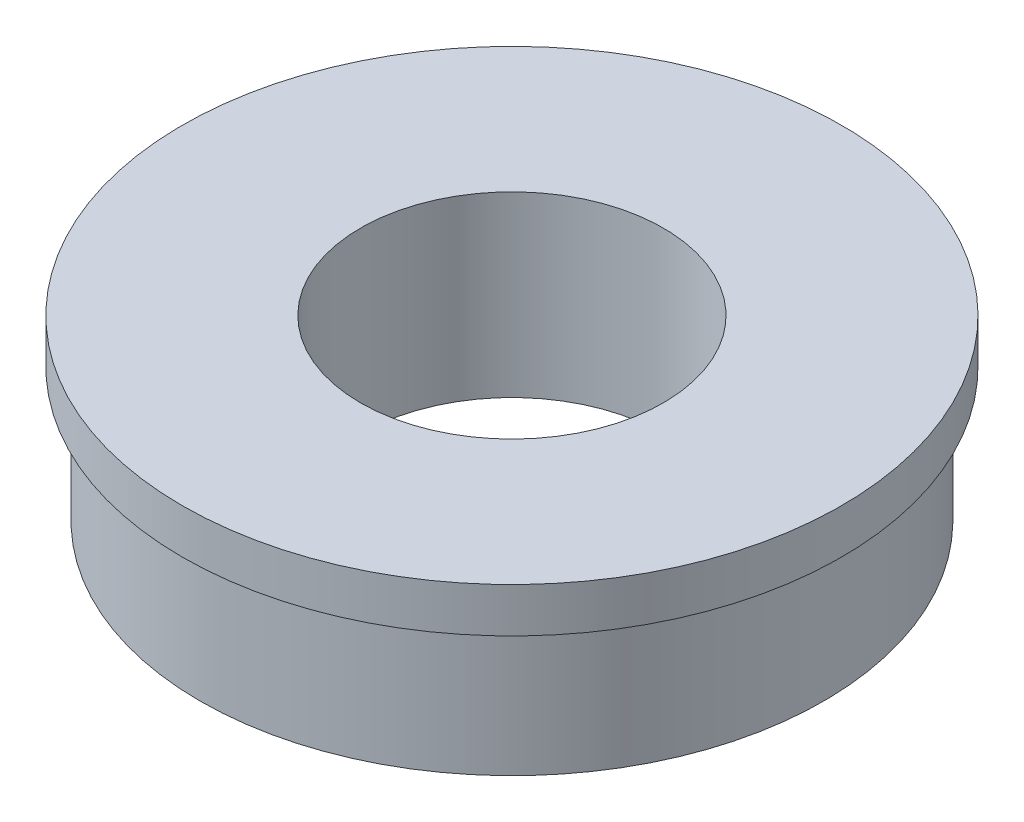
ISO-10303-21;
HEADER;
FILE_DESCRIPTION(('STEP AP214'),'2;1');
FILE_NAME('part.step','',(''),(''),'','','');
FILE_SCHEMA(('AUTOMOTIVE_DESIGN { 1 0 10303 214 1 1 1 1 }'));
ENDSEC;
DATA;
#1=APPLICATION_CONTEXT('core data for automotive mechanical design processes');
#2=APPLICATION_PROTOCOL_DEFINITION('international standard','automotive_design',2000,#1);
#3=PRODUCT_CONTEXT('',#1,'mechanical');
#4=PRODUCT('Part','Part','',(#3));
#5=PRODUCT_RELATED_PRODUCT_CATEGORY('part','',(#4));
#6=PRODUCT_DEFINITION_FORMATION('','',#4);
#7=PRODUCT_DEFINITION_CONTEXT('part definition',#1,'design');
#8=PRODUCT_DEFINITION('design','',#6,#7);
#9=PRODUCT_DEFINITION_SHAPE('','',#8);
#10=(LENGTH_UNIT() NAMED_UNIT(*) SI_UNIT(.MILLI.,.METRE.));
#11=(NAMED_UNIT(*) PLANE_ANGLE_UNIT() SI_UNIT($,.RADIAN.));
#12=(NAMED_UNIT(*) SI_UNIT($,.STERADIAN.) SOLID_ANGLE_UNIT());
#13=UNCERTAINTY_MEASURE_WITH_UNIT(LENGTH_MEASURE(1.E-05),#10,'distance_accuracy_value','');
#14=(GEOMETRIC_REPRESENTATION_CONTEXT(3) GLOBAL_UNCERTAINTY_ASSIGNED_CONTEXT((#13)) GLOBAL_UNIT_ASSIGNED_CONTEXT((#10,
#11,#12)) REPRESENTATION_CONTEXT('',''));
#15=CARTESIAN_POINT('',(0.,0.,0.));
#16=DIRECTION('',(0.,0.,1.));
#17=DIRECTION('',(1.,0.,0.));
#18=AXIS2_PLACEMENT_3D('',#15,#16,#17);
#19=CARTESIAN_POINT('',(0.,8.56488357358471,0.));
#20=DIRECTION('',(0.,1.,0.));
#21=DIRECTION('',(0.,0.,1.));
#22=AXIS2_PLACEMENT_3D('',#19,#20,#21);
#23=CYLINDRICAL_SURFACE('',#22,8.5);
#24=CARTESIAN_POINT('',(0.,-10.,0.));
#25=DIRECTION('',(0.,1.,0.));
#26=DIRECTION('',(0.,0.,1.));
#27=AXIS2_PLACEMENT_3D('',#24,#25,#26);
#28=CIRCLE('',#27,8.5);
#29=CARTESIAN_POINT('',(0.,-10.,8.5));
#30=VERTEX_POINT('',#29);
#31=EDGE_CURVE('E55',#30,#30,#28,.T.);
#32=ORIENTED_EDGE('',*,*,#31,.F.);
#33=EDGE_LOOP('',(#32));
#34=FACE_BOUND('',#33,.T.);
#35=CARTESIAN_POINT('',(0.,0.,0.));
#36=DIRECTION('',(0.,1.,0.));
#37=DIRECTION('',(0.,0.,1.));
#38=AXIS2_PLACEMENT_3D('',#35,#36,#37);
#39=CIRCLE('',#38,8.5);
#40=CARTESIAN_POINT('',(0.,0.,8.5));
#41=VERTEX_POINT('',#40);
#42=EDGE_CURVE('E10',#41,#41,#39,.T.);
#43=ORIENTED_EDGE('',*,*,#42,.T.);
#44=EDGE_LOOP('',(#43));
#45=FACE_BOUND('',#44,.T.);
#46=ADVANCED_FACE('F33',(#34,#45),#23,.F.);
#47=CARTESIAN_POINT('',(8.5,0.,0.));
#48=DIRECTION('',(0.,-1.,0.));
#49=DIRECTION('',(0.,0.,-1.));
#50=AXIS2_PLACEMENT_3D('',#47,#48,#49);
#51=PLANE('',#50);
#52=ORIENTED_EDGE('',*,*,#42,.F.);
#53=EDGE_LOOP('',(#52));
#54=FACE_BOUND('',#53,.T.);
#55=CARTESIAN_POINT('',(0.,0.,0.));
#56=DIRECTION('',(0.,1.,0.));
#57=DIRECTION('',(0.,0.,1.));
#58=AXIS2_PLACEMENT_3D('',#55,#56,#57);
#59=CIRCLE('',#58,18.5);
#60=CARTESIAN_POINT('',(0.,0.,18.5));
#61=VERTEX_POINT('',#60);
#62=EDGE_CURVE('E39',#61,#61,#59,.T.);
#63=ORIENTED_EDGE('',*,*,#62,.T.);
#64=EDGE_LOOP('',(#63));
#65=FACE_BOUND('',#64,.T.);
#66=ADVANCED_FACE('F62',(#54,#65),#51,.F.);
#67=CARTESIAN_POINT('',(0.,8.56488357358471,0.));
#68=DIRECTION('',(0.,1.,0.));
#69=DIRECTION('',(0.,0.,1.));
#70=AXIS2_PLACEMENT_3D('',#67,#68,#69);
#71=CYLINDRICAL_SURFACE('',#70,18.5);
#72=ORIENTED_EDGE('',*,*,#62,.F.);
#73=EDGE_LOOP('',(#72));
#74=FACE_BOUND('',#73,.T.);
#75=CARTESIAN_POINT('',(0.,-2.5,0.));
#76=DIRECTION('',(0.,1.,0.));
#77=DIRECTION('',(0.,0.,1.));
#78=AXIS2_PLACEMENT_3D('',#75,#76,#77);
#79=CIRCLE('',#78,18.5);
#80=CARTESIAN_POINT('',(0.,-2.5,18.5));
#81=VERTEX_POINT('',#80);
#82=EDGE_CURVE('E43',#81,#81,#79,.T.);
#83=ORIENTED_EDGE('',*,*,#82,.T.);
#84=EDGE_LOOP('',(#83));
#85=FACE_BOUND('',#84,.T.);
#86=ADVANCED_FACE('F66',(#74,#85),#71,.T.);
#87=CARTESIAN_POINT('',(18.5,-2.5,0.));
#88=DIRECTION('',(0.,1.,0.));
#89=DIRECTION('',(0.,0.,1.));
#90=AXIS2_PLACEMENT_3D('',#87,#88,#89);
#91=PLANE('',#90);
#92=ORIENTED_EDGE('',*,*,#82,.F.);
#93=EDGE_LOOP('',(#92));
#94=FACE_BOUND('',#93,.T.);
#95=CARTESIAN_POINT('',(0.,-2.5,0.));
#96=DIRECTION('',(0.,1.,0.));
#97=DIRECTION('',(0.,0.,1.));
#98=AXIS2_PLACEMENT_3D('',#95,#96,#97);
#99=CIRCLE('',#98,17.5);
#100=CARTESIAN_POINT('',(0.,-2.5,17.5));
#101=VERTEX_POINT('',#100);
#102=EDGE_CURVE('E47',#101,#101,#99,.T.);
#103=ORIENTED_EDGE('',*,*,#102,.T.);
#104=EDGE_LOOP('',(#103));
#105=FACE_BOUND('',#104,.T.);
#106=ADVANCED_FACE('F71',(#94,#105),#91,.F.);
#107=CARTESIAN_POINT('',(0.,8.56488357358471,0.));
#108=DIRECTION('',(0.,1.,0.));
#109=DIRECTION('',(0.,0.,1.));
#110=AXIS2_PLACEMENT_3D('',#107,#108,#109);
#111=CYLINDRICAL_SURFACE('',#110,17.5);
#112=ORIENTED_EDGE('',*,*,#102,.F.);
#113=EDGE_LOOP('',(#112));
#114=FACE_BOUND('',#113,.T.);
#115=CARTESIAN_POINT('',(0.,-10.,0.));
#116=DIRECTION('',(0.,1.,0.));
#117=DIRECTION('',(0.,0.,1.));
#118=AXIS2_PLACEMENT_3D('',#115,#116,#117);
#119=CIRCLE('',#118,17.5);
#120=CARTESIAN_POINT('',(0.,-10.,17.5));
#121=VERTEX_POINT('',#120);
#122=EDGE_CURVE('E52',#121,#121,#119,.T.);
#123=ORIENTED_EDGE('',*,*,#122,.T.);
#124=EDGE_LOOP('',(#123));
#125=FACE_BOUND('',#124,.T.);
#126=ADVANCED_FACE('F77',(#114,#125),#111,.T.);
#127=CARTESIAN_POINT('',(17.5,-10.,0.));
#128=DIRECTION('',(0.,1.,0.));
#129=DIRECTION('',(0.,0.,1.));
#130=AXIS2_PLACEMENT_3D('',#127,#128,#129);
#131=PLANE('',#130);
#132=ORIENTED_EDGE('',*,*,#122,.F.);
#133=EDGE_LOOP('',(#132));
#134=FACE_BOUND('',#133,.T.);
#135=ORIENTED_EDGE('',*,*,#31,.T.);
#136=EDGE_LOOP('',(#135));
#137=FACE_BOUND('',#136,.T.);
#138=ADVANCED_FACE('F59',(#134,#137),#131,.F.);
#139=CLOSED_SHELL('',(#46,#66,#86,#106,#126,#138));
#140=MANIFOLD_SOLID_BREP('B2',#139);
#141=ADVANCED_BREP_SHAPE_REPRESENTATION('',(#18,#140),#14);
#142=SHAPE_DEFINITION_REPRESENTATION(#9,#141);
ENDSEC;
END-ISO-10303-21;
